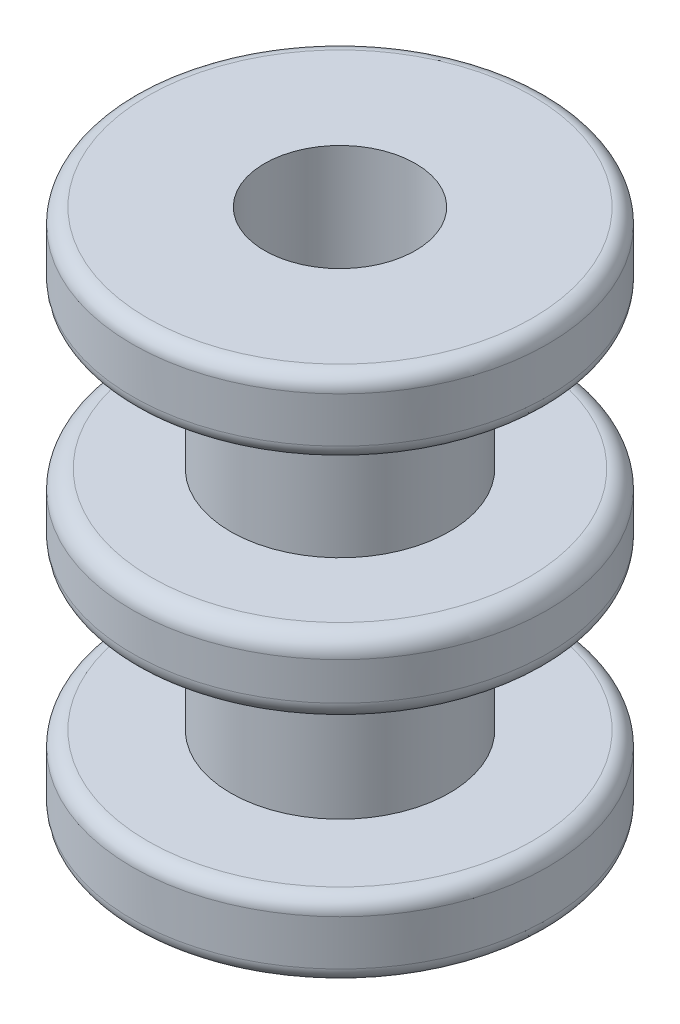
ISO-10303-21;
HEADER;
FILE_DESCRIPTION(('STEP AP214'),'2;1');
FILE_NAME('part.step','',(''),(''),'','','');
FILE_SCHEMA(('AUTOMOTIVE_DESIGN { 1 0 10303 214 1 1 1 1 }'));
ENDSEC;
DATA;
#1=APPLICATION_CONTEXT('core data for automotive mechanical design processes');
#2=APPLICATION_PROTOCOL_DEFINITION('international standard','automotive_design',2000,#1);
#3=PRODUCT_CONTEXT('',#1,'mechanical');
#4=PRODUCT('Part','Part','',(#3));
#5=PRODUCT_RELATED_PRODUCT_CATEGORY('part','',(#4));
#6=PRODUCT_DEFINITION_FORMATION('','',#4);
#7=PRODUCT_DEFINITION_CONTEXT('part definition',#1,'design');
#8=PRODUCT_DEFINITION('design','',#6,#7);
#9=PRODUCT_DEFINITION_SHAPE('','',#8);
#10=(LENGTH_UNIT() NAMED_UNIT(*) SI_UNIT(.MILLI.,.METRE.));
#11=(NAMED_UNIT(*) PLANE_ANGLE_UNIT() SI_UNIT($,.RADIAN.));
#12=(NAMED_UNIT(*) SI_UNIT($,.STERADIAN.) SOLID_ANGLE_UNIT());
#13=UNCERTAINTY_MEASURE_WITH_UNIT(LENGTH_MEASURE(1.E-05),#10,'distance_accuracy_value','');
#14=(GEOMETRIC_REPRESENTATION_CONTEXT(3) GLOBAL_UNCERTAINTY_ASSIGNED_CONTEXT((#13)) GLOBAL_UNIT_ASSIGNED_CONTEXT((#10,
#11,#12)) REPRESENTATION_CONTEXT('',''));
#15=CARTESIAN_POINT('',(0.,0.,0.));
#16=DIRECTION('',(0.,0.,1.));
#17=DIRECTION('',(1.,0.,0.));
#18=AXIS2_PLACEMENT_3D('',#15,#16,#17);
#19=CARTESIAN_POINT('',(0.,-9.6328473046239,0.));
#20=DIRECTION('',(0.,-1.,0.));
#21=DIRECTION('',(0.,0.,-1.));
#22=AXIS2_PLACEMENT_3D('',#19,#20,#21);
#23=CYLINDRICAL_SURFACE('',#22,2.);
#24=CARTESIAN_POINT('',(0.,-7.,0.));
#25=DIRECTION('',(0.,-1.,0.));
#26=DIRECTION('',(0.,0.,-1.));
#27=AXIS2_PLACEMENT_3D('',#24,#25,#26);
#28=CIRCLE('',#27,2.);
#29=CARTESIAN_POINT('',(0.,-7.,-2.));
#30=VERTEX_POINT('',#29);
#31=EDGE_CURVE('E76',#30,#30,#28,.T.);
#32=ORIENTED_EDGE('',*,*,#31,.T.);
#33=EDGE_LOOP('',(#32));
#34=FACE_BOUND('',#33,.T.);
#35=CARTESIAN_POINT('',(0.,7.,0.));
#36=DIRECTION('',(0.,-1.,0.));
#37=DIRECTION('',(0.,0.,-1.));
#38=AXIS2_PLACEMENT_3D('',#35,#36,#37);
#39=CIRCLE('',#38,2.);
#40=CARTESIAN_POINT('',(0.,7.,-2.));
#41=VERTEX_POINT('',#40);
#42=EDGE_CURVE('E91',#41,#41,#39,.T.);
#43=ORIENTED_EDGE('',*,*,#42,.F.);
#44=EDGE_LOOP('',(#43));
#45=FACE_BOUND('',#44,.T.);
#46=ADVANCED_FACE('F32',(#34,#45),#23,.F.);
#47=CARTESIAN_POINT('',(2.,-7.,0.));
#48=DIRECTION('',(0.,-1.,0.));
#49=DIRECTION('',(0.,0.,-1.));
#50=AXIS2_PLACEMENT_3D('',#47,#48,#49);
#51=PLANE('',#50);
#52=CARTESIAN_POINT('',(0.,-7.,0.));
#53=DIRECTION('',(0.,-1.,0.));
#54=DIRECTION('',(0.,0.,-1.));
#55=AXIS2_PLACEMENT_3D('',#52,#53,#54);
#56=CIRCLE('',#55,5.1);
#57=CARTESIAN_POINT('',(0.,-7.,-5.1));
#58=VERTEX_POINT('',#57);
#59=EDGE_CURVE('E61',#58,#58,#56,.T.);
#60=ORIENTED_EDGE('',*,*,#59,.T.);
#61=EDGE_LOOP('',(#60));
#62=FACE_BOUND('',#61,.T.);
#63=ORIENTED_EDGE('',*,*,#31,.F.);
#64=EDGE_LOOP('',(#63));
#65=FACE_BOUND('',#64,.T.);
#66=ADVANCED_FACE('F98',(#62,#65),#51,.T.);
#67=CARTESIAN_POINT('',(0.,-9.6328473046239,0.));
#68=DIRECTION('',(0.,-1.,0.));
#69=DIRECTION('',(0.,0.,-1.));
#70=AXIS2_PLACEMENT_3D('',#67,#68,#69);
#71=CYLINDRICAL_SURFACE('',#70,5.5);
#72=CARTESIAN_POINT('',(0.,-6.6,0.));
#73=DIRECTION('',(0.,-1.,0.));
#74=DIRECTION('',(0.,0.,-1.));
#75=AXIS2_PLACEMENT_3D('',#72,#73,#74);
#76=CIRCLE('',#75,5.5);
#77=CARTESIAN_POINT('',(0.,-6.6,-5.5));
#78=VERTEX_POINT('',#77);
#79=EDGE_CURVE('E55',#78,#78,#76,.F.);
#80=ORIENTED_EDGE('',*,*,#79,.T.);
#81=EDGE_LOOP('',(#80));
#82=FACE_BOUND('',#81,.T.);
#83=CARTESIAN_POINT('',(0.,-5.4,0.));
#84=DIRECTION('',(0.,1.,0.));
#85=DIRECTION('',(0.,0.,1.));
#86=AXIS2_PLACEMENT_3D('',#83,#84,#85);
#87=CIRCLE('',#86,5.5);
#88=CARTESIAN_POINT('',(0.,-5.4,5.5));
#89=VERTEX_POINT('',#88);
#90=EDGE_CURVE('E58',#89,#89,#87,.F.);
#91=ORIENTED_EDGE('',*,*,#90,.T.);
#92=EDGE_LOOP('',(#91));
#93=FACE_BOUND('',#92,.T.);
#94=ADVANCED_FACE('F104',(#82,#93),#71,.T.);
#95=CARTESIAN_POINT('',(5.5,-5.,0.));
#96=DIRECTION('',(0.,1.,0.));
#97=DIRECTION('',(0.,0.,1.));
#98=AXIS2_PLACEMENT_3D('',#95,#96,#97);
#99=PLANE('',#98);
#100=CARTESIAN_POINT('',(0.,-5.,0.));
#101=DIRECTION('',(0.,1.,0.));
#102=DIRECTION('',(0.,0.,1.));
#103=AXIS2_PLACEMENT_3D('',#100,#101,#102);
#104=CIRCLE('',#103,5.1);
#105=CARTESIAN_POINT('',(0.,-5.,5.1));
#106=VERTEX_POINT('',#105);
#107=EDGE_CURVE('E52',#106,#106,#104,.T.);
#108=ORIENTED_EDGE('',*,*,#107,.T.);
#109=EDGE_LOOP('',(#108));
#110=FACE_BOUND('',#109,.T.);
#111=CARTESIAN_POINT('',(0.,-5.,0.));
#112=DIRECTION('',(0.,-1.,0.));
#113=DIRECTION('',(0.,0.,-1.));
#114=AXIS2_PLACEMENT_3D('',#111,#112,#113);
#115=CIRCLE('',#114,2.9);
#116=CARTESIAN_POINT('',(0.,-5.,-2.9));
#117=VERTEX_POINT('',#116);
#118=EDGE_CURVE('E79',#117,#117,#115,.T.);
#119=ORIENTED_EDGE('',*,*,#118,.T.);
#120=EDGE_LOOP('',(#119));
#121=FACE_BOUND('',#120,.T.);
#122=ADVANCED_FACE('F165',(#110,#121),#99,.T.);
#123=CARTESIAN_POINT('',(0.,-9.6328473046239,0.));
#124=DIRECTION('',(0.,-1.,0.));
#125=DIRECTION('',(0.,0.,-1.));
#126=AXIS2_PLACEMENT_3D('',#123,#124,#125);
#127=CYLINDRICAL_SURFACE('',#126,2.9);
#128=CARTESIAN_POINT('',(0.,-1.,0.));
#129=DIRECTION('',(0.,-1.,0.));
#130=DIRECTION('',(0.,0.,-1.));
#131=AXIS2_PLACEMENT_3D('',#128,#129,#130);
#132=CIRCLE('',#131,2.9);
#133=CARTESIAN_POINT('',(0.,-1.,-2.9));
#134=VERTEX_POINT('',#133);
#135=EDGE_CURVE('E82',#134,#134,#132,.T.);
#136=ORIENTED_EDGE('',*,*,#135,.T.);
#137=EDGE_LOOP('',(#136));
#138=FACE_BOUND('',#137,.T.);
#139=ORIENTED_EDGE('',*,*,#118,.F.);
#140=EDGE_LOOP('',(#139));
#141=FACE_BOUND('',#140,.T.);
#142=ADVANCED_FACE('F161',(#138,#141),#127,.T.);
#143=CARTESIAN_POINT('',(2.9,-1.,0.));
#144=DIRECTION('',(0.,-1.,0.));
#145=DIRECTION('',(0.,0.,-1.));
#146=AXIS2_PLACEMENT_3D('',#143,#144,#145);
#147=PLANE('',#146);
#148=CARTESIAN_POINT('',(0.,-1.,0.));
#149=DIRECTION('',(0.,-1.,0.));
#150=DIRECTION('',(0.,0.,-1.));
#151=AXIS2_PLACEMENT_3D('',#148,#149,#150);
#152=CIRCLE('',#151,5.);
#153=CARTESIAN_POINT('',(0.,-1.,-5.));
#154=VERTEX_POINT('',#153);
#155=EDGE_CURVE('E73',#154,#154,#152,.T.);
#156=ORIENTED_EDGE('',*,*,#155,.T.);
#157=EDGE_LOOP('',(#156));
#158=FACE_BOUND('',#157,.T.);
#159=ORIENTED_EDGE('',*,*,#135,.F.);
#160=EDGE_LOOP('',(#159));
#161=FACE_BOUND('',#160,.T.);
#162=ADVANCED_FACE('F155',(#158,#161),#147,.T.);
#163=CARTESIAN_POINT('',(0.,-9.6328473046239,0.));
#164=DIRECTION('',(0.,-1.,0.));
#165=DIRECTION('',(0.,0.,-1.));
#166=AXIS2_PLACEMENT_3D('',#163,#164,#165);
#167=CYLINDRICAL_SURFACE('',#166,5.5);
#168=CARTESIAN_POINT('',(0.,-0.5,0.));
#169=DIRECTION('',(0.,-1.,0.));
#170=DIRECTION('',(0.,0.,-1.));
#171=AXIS2_PLACEMENT_3D('',#168,#169,#170);
#172=CIRCLE('',#171,5.5);
#173=CARTESIAN_POINT('',(0.,-0.5,-5.5));
#174=VERTEX_POINT('',#173);
#175=EDGE_CURVE('E67',#174,#174,#172,.F.);
#176=ORIENTED_EDGE('',*,*,#175,.T.);
#177=EDGE_LOOP('',(#176));
#178=FACE_BOUND('',#177,.T.);
#179=CARTESIAN_POINT('',(0.,0.5,0.));
#180=DIRECTION('',(0.,1.,0.));
#181=DIRECTION('',(0.,0.,1.));
#182=AXIS2_PLACEMENT_3D('',#179,#180,#181);
#183=CIRCLE('',#182,5.5);
#184=CARTESIAN_POINT('',(0.,0.5,5.5));
#185=VERTEX_POINT('',#184);
#186=EDGE_CURVE('E70',#185,#185,#183,.F.);
#187=ORIENTED_EDGE('',*,*,#186,.T.);
#188=EDGE_LOOP('',(#187));
#189=FACE_BOUND('',#188,.T.);
#190=ADVANCED_FACE('F149',(#178,#189),#167,.T.);
#191=CARTESIAN_POINT('',(2.9,1.,0.));
#192=DIRECTION('',(0.,1.,0.));
#193=DIRECTION('',(0.,0.,1.));
#194=AXIS2_PLACEMENT_3D('',#191,#192,#193);
#195=PLANE('',#194);
#196=CARTESIAN_POINT('',(0.,1.,0.));
#197=DIRECTION('',(0.,1.,0.));
#198=DIRECTION('',(0.,0.,1.));
#199=AXIS2_PLACEMENT_3D('',#196,#197,#198);
#200=CIRCLE('',#199,5.);
#201=CARTESIAN_POINT('',(0.,1.,5.));
#202=VERTEX_POINT('',#201);
#203=EDGE_CURVE('E64',#202,#202,#200,.T.);
#204=ORIENTED_EDGE('',*,*,#203,.T.);
#205=EDGE_LOOP('',(#204));
#206=FACE_BOUND('',#205,.T.);
#207=CARTESIAN_POINT('',(0.,1.,0.));
#208=DIRECTION('',(0.,-1.,0.));
#209=DIRECTION('',(0.,0.,-1.));
#210=AXIS2_PLACEMENT_3D('',#207,#208,#209);
#211=CIRCLE('',#210,2.9);
#212=CARTESIAN_POINT('',(0.,1.,-2.9));
#213=VERTEX_POINT('',#212);
#214=EDGE_CURVE('E85',#213,#213,#211,.T.);
#215=ORIENTED_EDGE('',*,*,#214,.T.);
#216=EDGE_LOOP('',(#215));
#217=FACE_BOUND('',#216,.T.);
#218=ADVANCED_FACE('F144',(#206,#217),#195,.T.);
#219=CARTESIAN_POINT('',(0.,-9.6328473046239,0.));
#220=DIRECTION('',(0.,-1.,0.));
#221=DIRECTION('',(0.,0.,-1.));
#222=AXIS2_PLACEMENT_3D('',#219,#220,#221);
#223=CYLINDRICAL_SURFACE('',#222,2.9);
#224=CARTESIAN_POINT('',(0.,5.,0.));
#225=DIRECTION('',(0.,-1.,0.));
#226=DIRECTION('',(0.,0.,-1.));
#227=AXIS2_PLACEMENT_3D('',#224,#225,#226);
#228=CIRCLE('',#227,2.9);
#229=CARTESIAN_POINT('',(0.,5.,-2.9));
#230=VERTEX_POINT('',#229);
#231=EDGE_CURVE('E88',#230,#230,#228,.T.);
#232=ORIENTED_EDGE('',*,*,#231,.T.);
#233=EDGE_LOOP('',(#232));
#234=FACE_BOUND('',#233,.T.);
#235=ORIENTED_EDGE('',*,*,#214,.F.);
#236=EDGE_LOOP('',(#235));
#237=FACE_BOUND('',#236,.T.);
#238=ADVANCED_FACE('F138',(#234,#237),#223,.T.);
#239=CARTESIAN_POINT('',(5.5,5.,0.));
#240=DIRECTION('',(0.,-1.,0.));
#241=DIRECTION('',(0.,0.,-1.));
#242=AXIS2_PLACEMENT_3D('',#239,#240,#241);
#243=PLANE('',#242);
#244=CARTESIAN_POINT('',(0.,5.,0.));
#245=DIRECTION('',(0.,-1.,0.));
#246=DIRECTION('',(0.,0.,-1.));
#247=AXIS2_PLACEMENT_3D('',#244,#245,#246);
#248=CIRCLE('',#247,5.1);
#249=CARTESIAN_POINT('',(0.,5.,-5.1));
#250=VERTEX_POINT('',#249);
#251=EDGE_CURVE('E47',#250,#250,#248,.T.);
#252=ORIENTED_EDGE('',*,*,#251,.T.);
#253=EDGE_LOOP('',(#252));
#254=FACE_BOUND('',#253,.T.);
#255=ORIENTED_EDGE('',*,*,#231,.F.);
#256=EDGE_LOOP('',(#255));
#257=FACE_BOUND('',#256,.T.);
#258=ADVANCED_FACE('F134',(#254,#257),#243,.T.);
#259=CARTESIAN_POINT('',(0.,-9.6328473046239,0.));
#260=DIRECTION('',(0.,-1.,0.));
#261=DIRECTION('',(0.,0.,-1.));
#262=AXIS2_PLACEMENT_3D('',#259,#260,#261);
#263=CYLINDRICAL_SURFACE('',#262,5.5);
#264=CARTESIAN_POINT('',(0.,5.4,0.));
#265=DIRECTION('',(0.,-1.,0.));
#266=DIRECTION('',(0.,0.,-1.));
#267=AXIS2_PLACEMENT_3D('',#264,#265,#266);
#268=CIRCLE('',#267,5.5);
#269=CARTESIAN_POINT('',(0.,5.4,-5.5));
#270=VERTEX_POINT('',#269);
#271=EDGE_CURVE('E39',#270,#270,#268,.F.);
#272=ORIENTED_EDGE('',*,*,#271,.T.);
#273=EDGE_LOOP('',(#272));
#274=FACE_BOUND('',#273,.T.);
#275=CARTESIAN_POINT('',(0.,6.6,0.));
#276=DIRECTION('',(0.,1.,0.));
#277=DIRECTION('',(0.,0.,1.));
#278=AXIS2_PLACEMENT_3D('',#275,#276,#277);
#279=CIRCLE('',#278,5.5);
#280=CARTESIAN_POINT('',(0.,6.6,5.5));
#281=VERTEX_POINT('',#280);
#282=EDGE_CURVE('E43',#281,#281,#279,.F.);
#283=ORIENTED_EDGE('',*,*,#282,.T.);
#284=EDGE_LOOP('',(#283));
#285=FACE_BOUND('',#284,.T.);
#286=ADVANCED_FACE('F137',(#274,#285),#263,.T.);
#287=CARTESIAN_POINT('',(2.,7.,0.));
#288=DIRECTION('',(0.,1.,0.));
#289=DIRECTION('',(0.,0.,1.));
#290=AXIS2_PLACEMENT_3D('',#287,#288,#289);
#291=PLANE('',#290);
#292=CARTESIAN_POINT('',(0.,7.,0.));
#293=DIRECTION('',(0.,1.,0.));
#294=DIRECTION('',(0.,0.,1.));
#295=AXIS2_PLACEMENT_3D('',#292,#293,#294);
#296=CIRCLE('',#295,5.1);
#297=CARTESIAN_POINT('',(0.,7.,5.1));
#298=VERTEX_POINT('',#297);
#299=EDGE_CURVE('E10',#298,#298,#296,.T.);
#300=ORIENTED_EDGE('',*,*,#299,.T.);
#301=EDGE_LOOP('',(#300));
#302=FACE_BOUND('',#301,.T.);
#303=ORIENTED_EDGE('',*,*,#42,.T.);
#304=EDGE_LOOP('',(#303));
#305=FACE_BOUND('',#304,.T.);
#306=ADVANCED_FACE('F95',(#302,#305),#291,.T.);
#307=CARTESIAN_POINT('',(0.,-0.5,0.));
#308=DIRECTION('',(0.,-1.,0.));
#309=DIRECTION('',(0.,0.,-1.));
#310=AXIS2_PLACEMENT_3D('',#307,#308,#309);
#311=TOROIDAL_SURFACE('',#310,5.,0.5);
#312=ORIENTED_EDGE('',*,*,#175,.F.);
#313=EDGE_LOOP('',(#312));
#314=FACE_BOUND('',#313,.T.);
#315=ORIENTED_EDGE('',*,*,#155,.F.);
#316=EDGE_LOOP('',(#315));
#317=FACE_BOUND('',#316,.T.);
#318=ADVANCED_FACE('F109',(#314,#317),#311,.T.);
#319=CARTESIAN_POINT('',(0.,0.5,0.));
#320=DIRECTION('',(0.,1.,0.));
#321=DIRECTION('',(0.,0.,1.));
#322=AXIS2_PLACEMENT_3D('',#319,#320,#321);
#323=TOROIDAL_SURFACE('',#322,5.,0.5);
#324=ORIENTED_EDGE('',*,*,#203,.F.);
#325=EDGE_LOOP('',(#324));
#326=FACE_BOUND('',#325,.T.);
#327=ORIENTED_EDGE('',*,*,#186,.F.);
#328=EDGE_LOOP('',(#327));
#329=FACE_BOUND('',#328,.T.);
#330=ADVANCED_FACE('F112',(#326,#329),#323,.T.);
#331=CARTESIAN_POINT('',(0.,-6.6,0.));
#332=DIRECTION('',(0.,-1.,0.));
#333=DIRECTION('',(0.,0.,-1.));
#334=AXIS2_PLACEMENT_3D('',#331,#332,#333);
#335=TOROIDAL_SURFACE('',#334,5.1,0.4);
#336=ORIENTED_EDGE('',*,*,#79,.F.);
#337=EDGE_LOOP('',(#336));
#338=FACE_BOUND('',#337,.T.);
#339=ORIENTED_EDGE('',*,*,#59,.F.);
#340=EDGE_LOOP('',(#339));
#341=FACE_BOUND('',#340,.T.);
#342=ADVANCED_FACE('F116',(#338,#341),#335,.T.);
#343=CARTESIAN_POINT('',(0.,-5.4,0.));
#344=DIRECTION('',(0.,1.,0.));
#345=DIRECTION('',(0.,0.,1.));
#346=AXIS2_PLACEMENT_3D('',#343,#344,#345);
#347=TOROIDAL_SURFACE('',#346,5.1,0.4);
#348=ORIENTED_EDGE('',*,*,#107,.F.);
#349=EDGE_LOOP('',(#348));
#350=FACE_BOUND('',#349,.T.);
#351=ORIENTED_EDGE('',*,*,#90,.F.);
#352=EDGE_LOOP('',(#351));
#353=FACE_BOUND('',#352,.T.);
#354=ADVANCED_FACE('F120',(#350,#353),#347,.T.);
#355=CARTESIAN_POINT('',(0.,5.4,0.));
#356=DIRECTION('',(0.,-1.,0.));
#357=DIRECTION('',(0.,0.,-1.));
#358=AXIS2_PLACEMENT_3D('',#355,#356,#357);
#359=TOROIDAL_SURFACE('',#358,5.1,0.4);
#360=ORIENTED_EDGE('',*,*,#271,.F.);
#361=EDGE_LOOP('',(#360));
#362=FACE_BOUND('',#361,.T.);
#363=ORIENTED_EDGE('',*,*,#251,.F.);
#364=EDGE_LOOP('',(#363));
#365=FACE_BOUND('',#364,.T.);
#366=ADVANCED_FACE('F123',(#362,#365),#359,.T.);
#367=CARTESIAN_POINT('',(0.,6.6,0.));
#368=DIRECTION('',(0.,1.,0.));
#369=DIRECTION('',(0.,0.,1.));
#370=AXIS2_PLACEMENT_3D('',#367,#368,#369);
#371=TOROIDAL_SURFACE('',#370,5.1,0.4);
#372=ORIENTED_EDGE('',*,*,#299,.F.);
#373=EDGE_LOOP('',(#372));
#374=FACE_BOUND('',#373,.T.);
#375=ORIENTED_EDGE('',*,*,#282,.F.);
#376=EDGE_LOOP('',(#375));
#377=FACE_BOUND('',#376,.T.);
#378=ADVANCED_FACE('F34',(#374,#377),#371,.T.);
#379=CLOSED_SHELL('',(#46,#66,#94,#122,#142,#162,#190,#218,#238,#258,#286,#306,#318,#330,#342,
#354,#366,#378));
#380=MANIFOLD_SOLID_BREP('B2',#379);
#381=ADVANCED_BREP_SHAPE_REPRESENTATION('',(#18,#380),#14);
#382=SHAPE_DEFINITION_REPRESENTATION(#9,#381);
ENDSEC;
END-ISO-10303-21;
